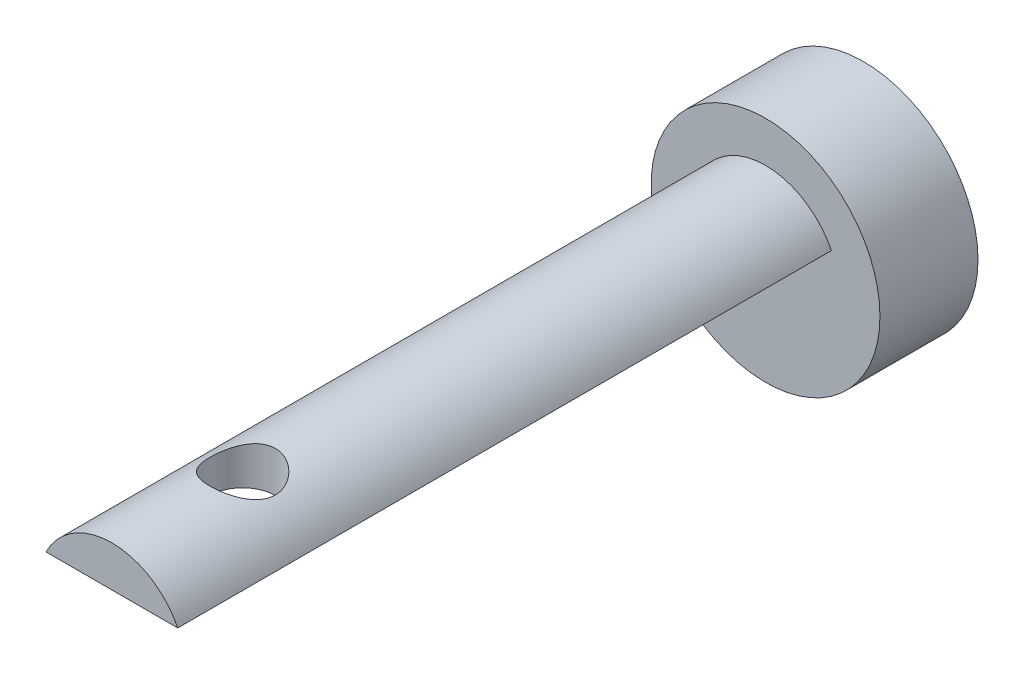
ISO-10303-21;
HEADER;
FILE_DESCRIPTION(('STEP AP214'),'2;1');
FILE_NAME('part.step','',(''),(''),'','','');
FILE_SCHEMA(('AUTOMOTIVE_DESIGN { 1 0 10303 214 1 1 1 1 }'));
ENDSEC;
DATA;
#1=APPLICATION_CONTEXT('core data for automotive mechanical design processes');
#2=APPLICATION_PROTOCOL_DEFINITION('international standard','automotive_design',2000,#1);
#3=PRODUCT_CONTEXT('',#1,'mechanical');
#4=PRODUCT('Part','Part','',(#3));
#5=PRODUCT_RELATED_PRODUCT_CATEGORY('part','',(#4));
#6=PRODUCT_DEFINITION_FORMATION('','',#4);
#7=PRODUCT_DEFINITION_CONTEXT('part definition',#1,'design');
#8=PRODUCT_DEFINITION('design','',#6,#7);
#9=PRODUCT_DEFINITION_SHAPE('','',#8);
#10=(LENGTH_UNIT() NAMED_UNIT(*) SI_UNIT(.MILLI.,.METRE.));
#11=(NAMED_UNIT(*) PLANE_ANGLE_UNIT() SI_UNIT($,.RADIAN.));
#12=(NAMED_UNIT(*) SI_UNIT($,.STERADIAN.) SOLID_ANGLE_UNIT());
#13=UNCERTAINTY_MEASURE_WITH_UNIT(LENGTH_MEASURE(1.E-05),#10,'distance_accuracy_value','');
#14=(GEOMETRIC_REPRESENTATION_CONTEXT(3) GLOBAL_UNCERTAINTY_ASSIGNED_CONTEXT((#13)) GLOBAL_UNIT_ASSIGNED_CONTEXT((#10,
#11,#12)) REPRESENTATION_CONTEXT('',''));
#15=CARTESIAN_POINT('',(0.,0.,0.));
#16=DIRECTION('',(0.,0.,1.));
#17=DIRECTION('',(1.,0.,0.));
#18=AXIS2_PLACEMENT_3D('',#15,#16,#17);
#19=CARTESIAN_POINT('',(0.,0.,0.));
#20=DIRECTION('',(0.,0.,1.));
#21=DIRECTION('',(1.,0.,0.));
#22=AXIS2_PLACEMENT_3D('',#19,#20,#21);
#23=PLANE('',#22);
#24=CARTESIAN_POINT('',(0.,0.,0.));
#25=DIRECTION('',(0.,0.,1.));
#26=DIRECTION('',(1.,0.,0.));
#27=AXIS2_PLACEMENT_3D('',#24,#25,#26);
#28=CIRCLE('',#27,3.5);
#29=CARTESIAN_POINT('',(3.5,0.,0.));
#30=VERTEX_POINT('',#29);
#31=EDGE_CURVE('E61',#30,#30,#28,.T.);
#32=ORIENTED_EDGE('',*,*,#31,.F.);
#33=EDGE_LOOP('',(#32));
#34=FACE_BOUND('',#33,.T.);
#35=ADVANCED_FACE('F47',(#34),#23,.F.);
#36=CARTESIAN_POINT('',(0.,0.,3.));
#37=DIRECTION('',(0.,0.,-1.));
#38=DIRECTION('',(-1.,0.,0.));
#39=AXIS2_PLACEMENT_3D('',#36,#37,#38);
#40=CYLINDRICAL_SURFACE('',#39,3.5);
#41=ORIENTED_EDGE('',*,*,#31,.T.);
#42=EDGE_LOOP('',(#41));
#43=FACE_BOUND('',#42,.T.);
#44=CARTESIAN_POINT('',(0.,0.,3.));
#45=DIRECTION('',(0.,0.,1.));
#46=DIRECTION('',(1.,0.,0.));
#47=AXIS2_PLACEMENT_3D('',#44,#45,#46);
#48=CIRCLE('',#47,3.5);
#49=CARTESIAN_POINT('',(3.5,0.,3.));
#50=VERTEX_POINT('',#49);
#51=EDGE_CURVE('E12',#50,#50,#48,.T.);
#52=ORIENTED_EDGE('',*,*,#51,.F.);
#53=EDGE_LOOP('',(#52));
#54=FACE_BOUND('',#53,.T.);
#55=ADVANCED_FACE('F49',(#43,#54),#40,.T.);
#56=CARTESIAN_POINT('',(0.,0.,3.));
#57=DIRECTION('',(0.,0.,1.));
#58=DIRECTION('',(1.,0.,0.));
#59=AXIS2_PLACEMENT_3D('',#56,#57,#58);
#60=PLANE('',#59);
#61=CARTESIAN_POINT('',(0.,0.,3.));
#62=DIRECTION('',(0.,0.,1.));
#63=DIRECTION('',(1.,0.,0.));
#64=AXIS2_PLACEMENT_3D('',#61,#62,#63);
#65=CIRCLE('',#64,2.25);
#66=CARTESIAN_POINT('',(2.01556443707464,1.,3.));
#67=VERTEX_POINT('',#66);
#68=CARTESIAN_POINT('',(-2.01556443707464,1.,3.));
#69=VERTEX_POINT('',#68);
#70=EDGE_CURVE('E84',#67,#69,#65,.T.);
#71=ORIENTED_EDGE('',*,*,#70,.F.);
#72=DIRECTION('',(1.,0.,0.));
#73=VECTOR('',#72,1.);
#74=CARTESIAN_POINT('',(0.,1.,3.));
#75=LINE('',#74,#73);
#76=EDGE_CURVE('E69',#69,#67,#75,.T.);
#77=ORIENTED_EDGE('',*,*,#76,.F.);
#78=EDGE_LOOP('',(#71,#77));
#79=FACE_BOUND('',#78,.T.);
#80=ORIENTED_EDGE('',*,*,#51,.T.);
#81=EDGE_LOOP('',(#80));
#82=FACE_BOUND('',#81,.T.);
#83=ADVANCED_FACE('F94',(#79,#82),#60,.T.);
#84=CARTESIAN_POINT('',(0.,1.,23.));
#85=DIRECTION('',(0.,1.,0.));
#86=DIRECTION('',(0.,0.,1.));
#87=AXIS2_PLACEMENT_3D('',#84,#85,#86);
#88=PLANE('',#87);
#89=CARTESIAN_POINT('',(0.,1.,19.));
#90=DIRECTION('',(0.,-1.,0.));
#91=DIRECTION('',(0.,0.,-1.));
#92=AXIS2_PLACEMENT_3D('',#89,#90,#91);
#93=CIRCLE('',#92,1.);
#94=CARTESIAN_POINT('',(0.,1.,18.));
#95=VERTEX_POINT('',#94);
#96=EDGE_CURVE('E98',#95,#95,#93,.T.);
#97=ORIENTED_EDGE('',*,*,#96,.F.);
#98=EDGE_LOOP('',(#97));
#99=FACE_BOUND('',#98,.T.);
#100=ORIENTED_EDGE('',*,*,#76,.T.);
#101=DIRECTION('',(0.,0.,-1.));
#102=VECTOR('',#101,1.);
#103=CARTESIAN_POINT('',(2.01556443707464,1.,23.));
#104=LINE('',#103,#102);
#105=CARTESIAN_POINT('',(2.01556443707464,1.,23.));
#106=VERTEX_POINT('',#105);
#107=EDGE_CURVE('E88',#106,#67,#104,.T.);
#108=ORIENTED_EDGE('',*,*,#107,.F.);
#109=DIRECTION('',(1.,0.,0.));
#110=VECTOR('',#109,1.);
#111=CARTESIAN_POINT('',(0.,1.,23.));
#112=LINE('',#111,#110);
#113=CARTESIAN_POINT('',(-2.01556443707464,1.,23.));
#114=VERTEX_POINT('',#113);
#115=EDGE_CURVE('E90',#114,#106,#112,.T.);
#116=ORIENTED_EDGE('',*,*,#115,.F.);
#117=DIRECTION('',(0.,0.,-1.));
#118=VECTOR('',#117,1.);
#119=CARTESIAN_POINT('',(-2.01556443707464,1.,23.));
#120=LINE('',#119,#118);
#121=EDGE_CURVE('E86',#114,#69,#120,.T.);
#122=ORIENTED_EDGE('',*,*,#121,.T.);
#123=EDGE_LOOP('',(#100,#108,#116,#122));
#124=FACE_BOUND('',#123,.T.);
#125=ADVANCED_FACE('F92',(#99,#124),#88,.F.);
#126=CARTESIAN_POINT('',(0.,0.,23.));
#127=DIRECTION('',(0.,0.,-1.));
#128=DIRECTION('',(-1.,0.,0.));
#129=AXIS2_PLACEMENT_3D('',#126,#127,#128);
#130=CYLINDRICAL_SURFACE('',#129,2.25);
#131=CARTESIAN_POINT('',(0.,2.25,18.));
#132=CARTESIAN_POINT('',(0.0532554659185889,2.24999511135048,18.0000063473506));
#133=CARTESIAN_POINT('',(0.106577530436506,2.24808803498228,18.0042787568107));
#134=CARTESIAN_POINT('',(0.211696313341409,2.24064250175497,18.0212081856696));
#135=CARTESIAN_POINT('',(0.263489053440064,2.23509531958046,18.0338853519842));
#136=CARTESIAN_POINT('',(0.363850916966471,2.22096174879085,18.0670505091418));
#137=CARTESIAN_POINT('',(0.412430824006017,2.21238621117243,18.0875106325673));
#138=CARTESIAN_POINT('',(0.505415730249007,2.19301475825376,18.1355375668161));
#139=CARTESIAN_POINT('',(0.549821677957488,2.1822193491909,18.1631027577052));
#140=CARTESIAN_POINT('',(0.635739992499942,2.15879993616987,18.2261674414015));
#141=CARTESIAN_POINT('',(0.676990818164825,2.14611090344928,18.2619988272839));
#142=CARTESIAN_POINT('',(0.753128325004851,2.12059265317293,18.339874125904));
#143=CARTESIAN_POINT('',(0.788011212567856,2.10776335684879,18.3819217150427));
#144=CARTESIAN_POINT('',(0.852423036191428,2.08258023551527,18.4739693626679));
#145=CARTESIAN_POINT('',(0.881526558016591,2.07029663189321,18.5242884076041));
#146=CARTESIAN_POINT('',(0.930740290188398,2.04864605580411,18.6297276230073));
#147=CARTESIAN_POINT('',(0.950855750666059,2.03927738163432,18.6848449681359));
#148=CARTESIAN_POINT('',(0.980405762251773,2.02523112420835,18.7953101903207));
#149=CARTESIAN_POINT('',(0.990346584909239,2.02033266269295,18.8504933672304));
#150=CARTESIAN_POINT('',(1.00083914149177,2.01515731968729,18.9619448850529));
#151=CARTESIAN_POINT('',(1.00139714603473,2.01487735162058,19.0182124760636));
#152=CARTESIAN_POINT('',(0.993485821512556,2.01878638355473,19.1248477243215));
#153=CARTESIAN_POINT('',(0.985820019509856,2.02257762855117,19.1752926845868));
#154=CARTESIAN_POINT('',(0.963040506308284,2.03352181022502,19.2740876124763));
#155=CARTESIAN_POINT('',(0.947925121354023,2.04067550235269,19.3224371066389));
#156=CARTESIAN_POINT('',(0.910376035627726,2.05770428570701,19.4169668138665));
#157=CARTESIAN_POINT('',(0.887785678682018,2.06763685897519,19.4630739725706));
#158=CARTESIAN_POINT('',(0.836040587446697,2.08909539162215,19.5510379572371));
#159=CARTESIAN_POINT('',(0.806883089335639,2.10062202107855,19.5928929828702));
#160=CARTESIAN_POINT('',(0.739504042519737,2.12533319458153,19.6754568007386));
#161=CARTESIAN_POINT('',(0.700676213791788,2.13856986016634,19.7156567392087));
#162=CARTESIAN_POINT('',(0.616719106061995,2.1642744980616,19.7891587217787));
#163=CARTESIAN_POINT('',(0.571587928862101,2.1767422371801,19.82245868048));
#164=CARTESIAN_POINT('',(0.474576379255937,2.19996224486656,19.882106613861));
#165=CARTESIAN_POINT('',(0.422536018799483,2.21065295965384,19.9082201715967));
#166=CARTESIAN_POINT('',(0.314203711433232,2.22862790336672,19.9511384749561));
#167=CARTESIAN_POINT('',(0.257914470354028,2.23591427938232,19.9679490891115));
#168=CARTESIAN_POINT('',(0.146910267747265,2.2458412921952,19.990655941343));
#169=CARTESIAN_POINT('',(0.0923605815208488,2.24877123051482,19.9972333486255));
#170=CARTESIAN_POINT('',(-0.0171385193954912,2.2506000193263,20.0013515615344));
#171=CARTESIAN_POINT('',(-0.0720877919819424,2.24950023903332,19.9988954365675));
#172=CARTESIAN_POINT('',(-0.177453708369243,2.24357647772824,19.9854782136596));
#173=CARTESIAN_POINT('',(-0.227948208866322,2.23897258878825,19.9750195537403));
#174=CARTESIAN_POINT('',(-0.326396036479248,2.22675271157043,19.9466210104485));
#175=CARTESIAN_POINT('',(-0.37434905396292,2.21913635723226,19.9286802178687));
#176=CARTESIAN_POINT('',(-0.46805202596665,2.20131188670333,19.8852555587948));
#177=CARTESIAN_POINT('',(-0.513686576668192,2.19103032614157,19.8595538264428));
#178=CARTESIAN_POINT('',(-0.600159639375064,2.16894061525661,19.8015742869911));
#179=CARTESIAN_POINT('',(-0.640996050392064,2.15713180090545,19.7692936159273));
#180=CARTESIAN_POINT('',(-0.720183606267879,2.13206396576625,19.6960416101007));
#181=CARTESIAN_POINT('',(-0.758069193698519,2.1187647704964,19.6545795312598));
#182=CARTESIAN_POINT('',(-0.826501211331949,2.09302067475821,19.5657223298422));
#183=CARTESIAN_POINT('',(-0.857045039647483,2.08057607826871,19.518325112903));
#184=CARTESIAN_POINT('',(-0.91053786568531,2.05773895078273,19.4174378460954));
#185=CARTESIAN_POINT('',(-0.933291638639681,2.04740148035177,19.3638308418156));
#186=CARTESIAN_POINT('',(-0.969232460087628,2.03063751400259,19.252936592348));
#187=CARTESIAN_POINT('',(-0.982428871839502,2.02420719128545,19.1956530091448));
#188=CARTESIAN_POINT('',(-0.997892739114449,2.01662526778851,19.0842592119019));
#189=CARTESIAN_POINT('',(-1.00099172334628,2.01507244117414,19.0302915607032));
#190=CARTESIAN_POINT('',(-0.998453874399204,2.01633144598305,18.9226201984324));
#191=CARTESIAN_POINT('',(-0.99281890399376,2.01914234671295,18.8689164335291));
#192=CARTESIAN_POINT('',(-0.973701132763464,2.02842482396161,18.7666540362513));
#193=CARTESIAN_POINT('',(-0.960710860144593,2.03466599695481,18.7179802400569));
#194=CARTESIAN_POINT('',(-0.92777097292937,2.04989473409227,18.6235090409007));
#195=CARTESIAN_POINT('',(-0.907819346374623,2.05888309212992,18.5777124740313));
#196=CARTESIAN_POINT('',(-0.860060545804444,2.07930527884415,18.4870811941894));
#197=CARTESIAN_POINT('',(-0.831831914674673,2.09085890484882,18.4424961687095));
#198=CARTESIAN_POINT('',(-0.768867986661114,2.11482294535827,18.3584375997314));
#199=CARTESIAN_POINT('',(-0.734129972078896,2.12723371635363,18.3189662028818));
#200=CARTESIAN_POINT('',(-0.655540642347485,2.15281618226999,18.2426887673483));
#201=CARTESIAN_POINT('',(-0.611157950232166,2.16595947242195,18.2064179172877));
#202=CARTESIAN_POINT('',(-0.516475905666192,2.19046588398484,18.1417824927262));
#203=CARTESIAN_POINT('',(-0.466173865202286,2.20182819113615,18.1134215300088));
#204=CARTESIAN_POINT('',(-0.361525056195782,2.22139629471516,18.0658876939803));
#205=CARTESIAN_POINT('',(-0.307230454369046,2.22963633024829,18.0466145536295));
#206=CARTESIAN_POINT('',(-0.195810676259318,2.24215858416623,18.01768151182));
#207=CARTESIAN_POINT('',(-0.138694699549948,2.24645287290451,18.0079922854007));
#208=CARTESIAN_POINT('',(-0.054182016207977,2.24951242368149,18.0010981923038));
#209=CARTESIAN_POINT('',(-0.0270996306091857,2.25000248764317,17.9999967700807));
#210=CARTESIAN_POINT('',(0.,2.25,18.));
#211=B_SPLINE_CURVE_WITH_KNOTS('',3,(#131,#132,#133,#134,#135,#136,#137,#138,#139,#140,#141,
#142,#143,#144,#145,#146,#147,#148,#149,#150,#151,#152,#153,#154,#155,#156,#157,#158,#159,#160,
#161,#162,#163,#164,#165,#166,#167,#168,#169,#170,#171,#172,#173,#174,#175,#176,#177,#178,#179,
#180,#181,#182,#183,#184,#185,#186,#187,#188,#189,#190,#191,#192,#193,#194,#195,#196,#197,#198,
#199,#200,#201,#202,#203,#204,#205,#206,#207,#208,#209,#210),.UNSPECIFIED.,.T.,.F.,(4,2,2,2,2,2,
2,2,2,2,2,2,2,2,2,2,2,2,2,2,2,2,2,2,2,2,2,2,2,2,2,2,2,2,2,2,2,2,2,4),(0.,0.159681878910111,
0.319747919519924,0.479246146549303,0.638708040574723,0.80626955430014,0.97393056704955,
1.15127198270406,1.32850967335026,1.49642237746342,1.66422285961174,1.81700425015333,
1.96981998293039,2.12606592660329,2.28237775061561,2.45391673374922,2.62550748617086,
2.80216697951325,2.97871490418316,3.1429140648838,3.30705743927525,3.46166393102078,
3.61628921558037,3.7757384777183,3.93525730063716,4.1076325833433,4.28006886532161,
4.45655507823355,4.63286815448326,4.79423699929666,4.95557143217939,5.10719982475702,
5.2588720770592,5.42026348522141,5.58172242580081,5.75730509177075,5.93296780087361,
6.10664422570444,6.27978757430918,6.36104345779089),.UNSPECIFIED.);
#212=CARTESIAN_POINT('',(0.,2.25,18.));
#213=VERTEX_POINT('',#212);
#214=EDGE_CURVE('E51',#213,#213,#211,.T.);
#215=ORIENTED_EDGE('',*,*,#214,.T.);
#216=EDGE_LOOP('',(#215));
#217=FACE_BOUND('',#216,.T.);
#218=ORIENTED_EDGE('',*,*,#70,.T.);
#219=ORIENTED_EDGE('',*,*,#121,.F.);
#220=CARTESIAN_POINT('',(0.,0.,23.));
#221=DIRECTION('',(0.,0.,1.));
#222=DIRECTION('',(1.,0.,0.));
#223=AXIS2_PLACEMENT_3D('',#220,#221,#222);
#224=CIRCLE('',#223,2.25);
#225=EDGE_CURVE('E77',#106,#114,#224,.T.);
#226=ORIENTED_EDGE('',*,*,#225,.F.);
#227=ORIENTED_EDGE('',*,*,#107,.T.);
#228=EDGE_LOOP('',(#218,#219,#226,#227));
#229=FACE_BOUND('',#228,.T.);
#230=ADVANCED_FACE('F85',(#217,#229),#130,.T.);
#231=CARTESIAN_POINT('',(0.,0.,23.));
#232=DIRECTION('',(0.,0.,1.));
#233=DIRECTION('',(1.,0.,0.));
#234=AXIS2_PLACEMENT_3D('',#231,#232,#233);
#235=PLANE('',#234);
#236=ORIENTED_EDGE('',*,*,#115,.T.);
#237=ORIENTED_EDGE('',*,*,#225,.T.);
#238=EDGE_LOOP('',(#236,#237));
#239=FACE_BOUND('',#238,.T.);
#240=ADVANCED_FACE('F121',(#239),#235,.T.);
#241=CARTESIAN_POINT('',(0.,11.,19.));
#242=DIRECTION('',(0.,-1.,0.));
#243=DIRECTION('',(0.,0.,-1.));
#244=AXIS2_PLACEMENT_3D('',#241,#242,#243);
#245=CYLINDRICAL_SURFACE('',#244,1.);
#246=ORIENTED_EDGE('',*,*,#96,.T.);
#247=EDGE_LOOP('',(#246));
#248=FACE_BOUND('',#247,.T.);
#249=ORIENTED_EDGE('',*,*,#214,.F.);
#250=EDGE_LOOP('',(#249));
#251=FACE_BOUND('',#250,.T.);
#252=ADVANCED_FACE('F124',(#248,#251),#245,.F.);
#253=CLOSED_SHELL('',(#35,#55,#83,#125,#230,#240,#252));
#254=MANIFOLD_SOLID_BREP('B2',#253);
#255=ADVANCED_BREP_SHAPE_REPRESENTATION('',(#18,#254),#14);
#256=SHAPE_DEFINITION_REPRESENTATION(#9,#255);
ENDSEC;
END-ISO-10303-21;
